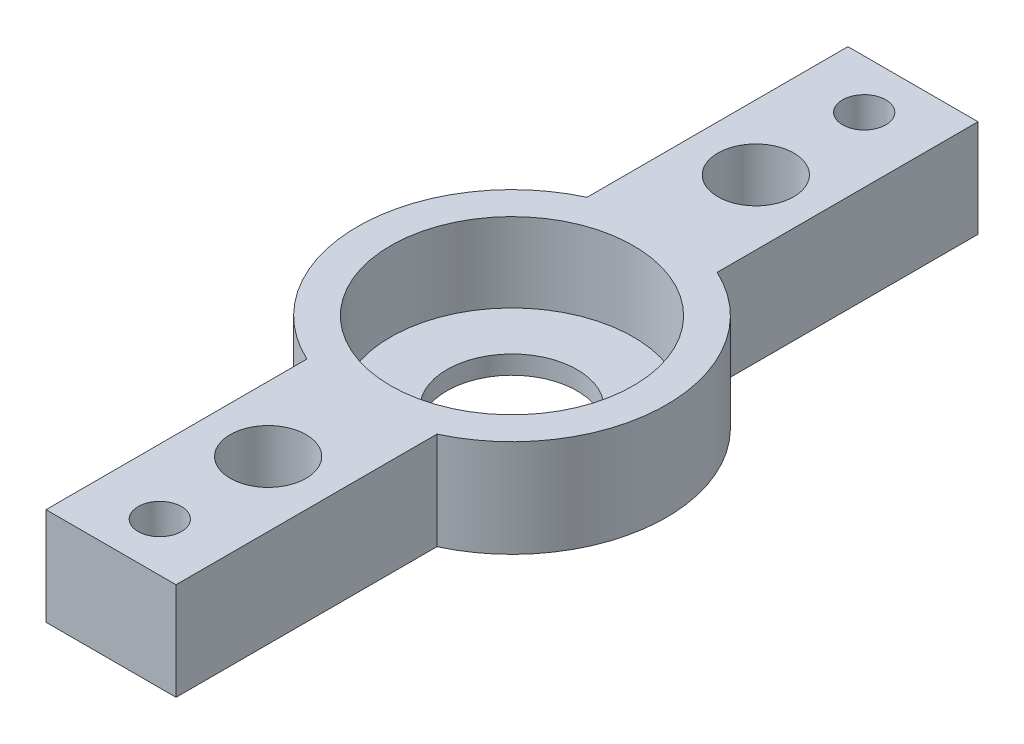
ISO-10303-21;
HEADER;
FILE_DESCRIPTION(('STEP AP214'),'2;1');
FILE_NAME('part.step','',(''),(''),'','','');
FILE_SCHEMA(('AUTOMOTIVE_DESIGN { 1 0 10303 214 1 1 1 1 }'));
ENDSEC;
DATA;
#1=APPLICATION_CONTEXT('core data for automotive mechanical design processes');
#2=APPLICATION_PROTOCOL_DEFINITION('international standard','automotive_design',2000,#1);
#3=PRODUCT_CONTEXT('',#1,'mechanical');
#4=PRODUCT('Part','Part','',(#3));
#5=PRODUCT_RELATED_PRODUCT_CATEGORY('part','',(#4));
#6=PRODUCT_DEFINITION_FORMATION('','',#4);
#7=PRODUCT_DEFINITION_CONTEXT('part definition',#1,'design');
#8=PRODUCT_DEFINITION('design','',#6,#7);
#9=PRODUCT_DEFINITION_SHAPE('','',#8);
#10=(LENGTH_UNIT() NAMED_UNIT(*) SI_UNIT(.MILLI.,.METRE.));
#11=(NAMED_UNIT(*) PLANE_ANGLE_UNIT() SI_UNIT($,.RADIAN.));
#12=(NAMED_UNIT(*) SI_UNIT($,.STERADIAN.) SOLID_ANGLE_UNIT());
#13=UNCERTAINTY_MEASURE_WITH_UNIT(LENGTH_MEASURE(1.E-05),#10,'distance_accuracy_value','');
#14=(GEOMETRIC_REPRESENTATION_CONTEXT(3) GLOBAL_UNCERTAINTY_ASSIGNED_CONTEXT((#13)) GLOBAL_UNIT_ASSIGNED_CONTEXT((#10,
#11,#12)) REPRESENTATION_CONTEXT('',''));
#15=CARTESIAN_POINT('',(0.,0.,0.));
#16=DIRECTION('',(0.,0.,1.));
#17=DIRECTION('',(1.,0.,0.));
#18=AXIS2_PLACEMENT_3D('',#15,#16,#17);
#19=CARTESIAN_POINT('',(0.,9.,0.));
#20=DIRECTION('',(0.,1.,0.));
#21=DIRECTION('',(0.,0.,1.));
#22=AXIS2_PLACEMENT_3D('',#19,#20,#21);
#23=PLANE('',#22);
#24=CARTESIAN_POINT('',(0.,9.,0.));
#25=DIRECTION('',(0.,1.,0.));
#26=DIRECTION('',(0.,0.,1.));
#27=AXIS2_PLACEMENT_3D('',#24,#25,#26);
#28=CIRCLE('',#27,11.2);
#29=CARTESIAN_POINT('',(0.,9.,11.2));
#30=VERTEX_POINT('',#29);
#31=EDGE_CURVE('E241',#30,#30,#28,.T.);
#32=ORIENTED_EDGE('',*,*,#31,.F.);
#33=EDGE_LOOP('',(#32));
#34=FACE_BOUND('',#33,.T.);
#35=CARTESIAN_POINT('',(0.,9.,22.5));
#36=DIRECTION('',(0.,1.,0.));
#37=DIRECTION('',(0.,0.,-1.));
#38=AXIS2_PLACEMENT_3D('',#35,#36,#37);
#39=CIRCLE('',#38,3.5);
#40=CARTESIAN_POINT('',(0.,9.,19.));
#41=VERTEX_POINT('',#40);
#42=EDGE_CURVE('E221',#41,#41,#39,.T.);
#43=ORIENTED_EDGE('',*,*,#42,.F.);
#44=EDGE_LOOP('',(#43));
#45=FACE_BOUND('',#44,.T.);
#46=CARTESIAN_POINT('',(0.,9.,-22.5));
#47=DIRECTION('',(0.,1.,0.));
#48=DIRECTION('',(0.,0.,1.));
#49=AXIS2_PLACEMENT_3D('',#46,#47,#48);
#50=CIRCLE('',#49,3.5);
#51=CARTESIAN_POINT('',(0.,9.,-19.));
#52=VERTEX_POINT('',#51);
#53=EDGE_CURVE('E146',#52,#52,#50,.T.);
#54=ORIENTED_EDGE('',*,*,#53,.F.);
#55=EDGE_LOOP('',(#54));
#56=FACE_BOUND('',#55,.T.);
#57=DIRECTION('',(0.,0.,1.));
#58=VECTOR('',#57,1.);
#59=CARTESIAN_POINT('',(-6.,9.,-37.));
#60=LINE('',#59,#58);
#61=CARTESIAN_POINT('',(-6.,9.,-37.));
#62=VERTEX_POINT('',#61);
#63=CARTESIAN_POINT('',(-6.,9.,-12.9252659547106));
#64=VERTEX_POINT('',#63);
#65=EDGE_CURVE('E164',#62,#64,#60,.T.);
#66=ORIENTED_EDGE('',*,*,#65,.T.);
#67=CARTESIAN_POINT('',(0.,9.,0.));
#68=DIRECTION('',(0.,1.,0.));
#69=DIRECTION('',(0.,0.,1.));
#70=AXIS2_PLACEMENT_3D('',#67,#68,#69);
#71=CIRCLE('',#70,14.25);
#72=CARTESIAN_POINT('',(-6.,9.,12.9252659547106));
#73=VERTEX_POINT('',#72);
#74=EDGE_CURVE('E100',#64,#73,#71,.T.);
#75=ORIENTED_EDGE('',*,*,#74,.T.);
#76=DIRECTION('',(0.,0.,1.));
#77=VECTOR('',#76,1.);
#78=CARTESIAN_POINT('',(-6.,9.,37.));
#79=LINE('',#78,#77);
#80=CARTESIAN_POINT('',(-6.,9.,37.));
#81=VERTEX_POINT('',#80);
#82=EDGE_CURVE('E185',#73,#81,#79,.T.);
#83=ORIENTED_EDGE('',*,*,#82,.T.);
#84=DIRECTION('',(1.,0.,0.));
#85=VECTOR('',#84,1.);
#86=CARTESIAN_POINT('',(-6.,9.,37.));
#87=LINE('',#86,#85);
#88=CARTESIAN_POINT('',(6.,9.,37.));
#89=VERTEX_POINT('',#88);
#90=EDGE_CURVE('E199',#81,#89,#87,.T.);
#91=ORIENTED_EDGE('',*,*,#90,.T.);
#92=DIRECTION('',(0.,0.,-1.));
#93=VECTOR('',#92,1.);
#94=CARTESIAN_POINT('',(6.,9.,37.));
#95=LINE('',#94,#93);
#96=CARTESIAN_POINT('',(6.,9.,12.9252659547106));
#97=VERTEX_POINT('',#96);
#98=EDGE_CURVE('E119',#89,#97,#95,.T.);
#99=ORIENTED_EDGE('',*,*,#98,.T.);
#100=CARTESIAN_POINT('',(0.,9.,0.));
#101=DIRECTION('',(0.,1.,0.));
#102=DIRECTION('',(0.,0.,1.));
#103=AXIS2_PLACEMENT_3D('',#100,#101,#102);
#104=CIRCLE('',#103,14.25);
#105=CARTESIAN_POINT('',(6.,9.,-12.9252659547106));
#106=VERTEX_POINT('',#105);
#107=EDGE_CURVE('E113',#97,#106,#104,.T.);
#108=ORIENTED_EDGE('',*,*,#107,.T.);
#109=DIRECTION('',(0.,0.,-1.));
#110=VECTOR('',#109,1.);
#111=CARTESIAN_POINT('',(6.,9.,-37.));
#112=LINE('',#111,#110);
#113=CARTESIAN_POINT('',(6.,9.,-37.));
#114=VERTEX_POINT('',#113);
#115=EDGE_CURVE('E117',#106,#114,#112,.T.);
#116=ORIENTED_EDGE('',*,*,#115,.T.);
#117=DIRECTION('',(-1.,0.,0.));
#118=VECTOR('',#117,1.);
#119=CARTESIAN_POINT('',(-6.,9.,-37.));
#120=LINE('',#119,#118);
#121=EDGE_CURVE('E57',#114,#62,#120,.T.);
#122=ORIENTED_EDGE('',*,*,#121,.T.);
#123=EDGE_LOOP('',(#66,#75,#83,#91,#99,#108,#116,#122));
#124=FACE_BOUND('',#123,.T.);
#125=CARTESIAN_POINT('',(0.,9.,-32.5));
#126=DIRECTION('',(0.,1.,0.));
#127=DIRECTION('',(0.,0.,1.));
#128=AXIS2_PLACEMENT_3D('',#125,#126,#127);
#129=CIRCLE('',#128,2.);
#130=CARTESIAN_POINT('',(0.,9.,-30.5));
#131=VERTEX_POINT('',#130);
#132=EDGE_CURVE('E213',#131,#131,#129,.T.);
#133=ORIENTED_EDGE('',*,*,#132,.F.);
#134=EDGE_LOOP('',(#133));
#135=FACE_BOUND('',#134,.T.);
#136=CARTESIAN_POINT('',(0.,9.,32.5));
#137=DIRECTION('',(0.,1.,0.));
#138=DIRECTION('',(0.,0.,-1.));
#139=AXIS2_PLACEMENT_3D('',#136,#137,#138);
#140=CIRCLE('',#139,2.);
#141=CARTESIAN_POINT('',(0.,9.,30.5));
#142=VERTEX_POINT('',#141);
#143=EDGE_CURVE('E229',#142,#142,#140,.T.);
#144=ORIENTED_EDGE('',*,*,#143,.F.);
#145=EDGE_LOOP('',(#144));
#146=FACE_BOUND('',#145,.T.);
#147=ADVANCED_FACE('F39',(#34,#45,#56,#124,#135,#146),#23,.T.);
#148=CARTESIAN_POINT('',(0.,0.,0.));
#149=DIRECTION('',(0.,1.,0.));
#150=DIRECTION('',(0.,0.,1.));
#151=AXIS2_PLACEMENT_3D('',#148,#149,#150);
#152=PLANE('',#151);
#153=CARTESIAN_POINT('',(0.,0.,0.));
#154=DIRECTION('',(0.,1.,0.));
#155=DIRECTION('',(0.,0.,1.));
#156=AXIS2_PLACEMENT_3D('',#153,#154,#155);
#157=CIRCLE('',#156,6.);
#158=CARTESIAN_POINT('',(0.,0.,6.));
#159=VERTEX_POINT('',#158);
#160=EDGE_CURVE('E245',#159,#159,#157,.F.);
#161=ORIENTED_EDGE('',*,*,#160,.F.);
#162=EDGE_LOOP('',(#161));
#163=FACE_BOUND('',#162,.T.);
#164=DIRECTION('',(0.,0.,1.));
#165=VECTOR('',#164,1.);
#166=CARTESIAN_POINT('',(-6.,0.,-37.));
#167=LINE('',#166,#165);
#168=CARTESIAN_POINT('',(-6.,0.,-37.));
#169=VERTEX_POINT('',#168);
#170=CARTESIAN_POINT('',(-6.,0.,-12.9252659547106));
#171=VERTEX_POINT('',#170);
#172=EDGE_CURVE('E141',#169,#171,#167,.T.);
#173=ORIENTED_EDGE('',*,*,#172,.F.);
#174=DIRECTION('',(-1.,0.,0.));
#175=VECTOR('',#174,1.);
#176=CARTESIAN_POINT('',(-6.,0.,-37.));
#177=LINE('',#176,#175);
#178=CARTESIAN_POINT('',(6.,0.,-37.));
#179=VERTEX_POINT('',#178);
#180=EDGE_CURVE('E92',#179,#169,#177,.T.);
#181=ORIENTED_EDGE('',*,*,#180,.F.);
#182=DIRECTION('',(0.,0.,-1.));
#183=VECTOR('',#182,1.);
#184=CARTESIAN_POINT('',(6.,0.,-37.));
#185=LINE('',#184,#183);
#186=CARTESIAN_POINT('',(6.,0.,-12.9252659547106));
#187=VERTEX_POINT('',#186);
#188=EDGE_CURVE('E86',#187,#179,#185,.T.);
#189=ORIENTED_EDGE('',*,*,#188,.F.);
#190=CARTESIAN_POINT('',(0.,0.,0.));
#191=DIRECTION('',(0.,1.,0.));
#192=DIRECTION('',(0.,0.,1.));
#193=AXIS2_PLACEMENT_3D('',#190,#191,#192);
#194=CIRCLE('',#193,14.25);
#195=CARTESIAN_POINT('',(6.,0.,12.9252659547106));
#196=VERTEX_POINT('',#195);
#197=EDGE_CURVE('E128',#196,#187,#194,.T.);
#198=ORIENTED_EDGE('',*,*,#197,.F.);
#199=DIRECTION('',(0.,0.,-1.));
#200=VECTOR('',#199,1.);
#201=CARTESIAN_POINT('',(6.,0.,37.));
#202=LINE('',#201,#200);
#203=CARTESIAN_POINT('',(6.,0.,37.));
#204=VERTEX_POINT('',#203);
#205=EDGE_CURVE('E155',#204,#196,#202,.T.);
#206=ORIENTED_EDGE('',*,*,#205,.F.);
#207=DIRECTION('',(1.,0.,0.));
#208=VECTOR('',#207,1.);
#209=CARTESIAN_POINT('',(-6.,0.,37.));
#210=LINE('',#209,#208);
#211=CARTESIAN_POINT('',(-6.,0.,37.));
#212=VERTEX_POINT('',#211);
#213=EDGE_CURVE('E152',#212,#204,#210,.T.);
#214=ORIENTED_EDGE('',*,*,#213,.F.);
#215=DIRECTION('',(0.,0.,1.));
#216=VECTOR('',#215,1.);
#217=CARTESIAN_POINT('',(-6.,0.,37.));
#218=LINE('',#217,#216);
#219=CARTESIAN_POINT('',(-6.,0.,12.9252659547106));
#220=VERTEX_POINT('',#219);
#221=EDGE_CURVE('E149',#220,#212,#218,.T.);
#222=ORIENTED_EDGE('',*,*,#221,.F.);
#223=CARTESIAN_POINT('',(0.,0.,0.));
#224=DIRECTION('',(0.,1.,0.));
#225=DIRECTION('',(0.,0.,1.));
#226=AXIS2_PLACEMENT_3D('',#223,#224,#225);
#227=CIRCLE('',#226,14.25);
#228=EDGE_CURVE('E145',#171,#220,#227,.T.);
#229=ORIENTED_EDGE('',*,*,#228,.F.);
#230=EDGE_LOOP('',(#173,#181,#189,#198,#206,#214,#222,#229));
#231=FACE_BOUND('',#230,.T.);
#232=CARTESIAN_POINT('',(0.,0.,-22.5));
#233=DIRECTION('',(0.,1.,0.));
#234=DIRECTION('',(0.,0.,1.));
#235=AXIS2_PLACEMENT_3D('',#232,#233,#234);
#236=CIRCLE('',#235,3.5);
#237=CARTESIAN_POINT('',(0.,0.,-19.));
#238=VERTEX_POINT('',#237);
#239=EDGE_CURVE('E209',#238,#238,#236,.T.);
#240=ORIENTED_EDGE('',*,*,#239,.T.);
#241=EDGE_LOOP('',(#240));
#242=FACE_BOUND('',#241,.T.);
#243=CARTESIAN_POINT('',(0.,0.,-32.5));
#244=DIRECTION('',(0.,1.,0.));
#245=DIRECTION('',(0.,0.,1.));
#246=AXIS2_PLACEMENT_3D('',#243,#244,#245);
#247=CIRCLE('',#246,2.);
#248=CARTESIAN_POINT('',(0.,0.,-30.5));
#249=VERTEX_POINT('',#248);
#250=EDGE_CURVE('E217',#249,#249,#247,.T.);
#251=ORIENTED_EDGE('',*,*,#250,.T.);
#252=EDGE_LOOP('',(#251));
#253=FACE_BOUND('',#252,.T.);
#254=CARTESIAN_POINT('',(0.,0.,22.5));
#255=DIRECTION('',(0.,1.,0.));
#256=DIRECTION('',(0.,0.,-1.));
#257=AXIS2_PLACEMENT_3D('',#254,#255,#256);
#258=CIRCLE('',#257,3.5);
#259=CARTESIAN_POINT('',(0.,0.,19.));
#260=VERTEX_POINT('',#259);
#261=EDGE_CURVE('E225',#260,#260,#258,.T.);
#262=ORIENTED_EDGE('',*,*,#261,.T.);
#263=EDGE_LOOP('',(#262));
#264=FACE_BOUND('',#263,.T.);
#265=CARTESIAN_POINT('',(0.,0.,32.5));
#266=DIRECTION('',(0.,1.,0.));
#267=DIRECTION('',(0.,0.,-1.));
#268=AXIS2_PLACEMENT_3D('',#265,#266,#267);
#269=CIRCLE('',#268,2.);
#270=CARTESIAN_POINT('',(0.,0.,30.5));
#271=VERTEX_POINT('',#270);
#272=EDGE_CURVE('E233',#271,#271,#269,.T.);
#273=ORIENTED_EDGE('',*,*,#272,.T.);
#274=EDGE_LOOP('',(#273));
#275=FACE_BOUND('',#274,.T.);
#276=ADVANCED_FACE('F189',(#163,#231,#242,#253,#264,#275),#152,.F.);
#277=CARTESIAN_POINT('',(-6.,9.,-37.));
#278=DIRECTION('',(1.,0.,0.));
#279=DIRECTION('',(0.,0.,-1.));
#280=AXIS2_PLACEMENT_3D('',#277,#278,#279);
#281=PLANE('',#280);
#282=ORIENTED_EDGE('',*,*,#172,.T.);
#283=DIRECTION('',(0.,-1.,0.));
#284=VECTOR('',#283,1.);
#285=CARTESIAN_POINT('',(-6.,9.,-12.9252659547106));
#286=LINE('',#285,#284);
#287=EDGE_CURVE('E11',#64,#171,#286,.T.);
#288=ORIENTED_EDGE('',*,*,#287,.F.);
#289=ORIENTED_EDGE('',*,*,#65,.F.);
#290=DIRECTION('',(0.,-1.,0.));
#291=VECTOR('',#290,1.);
#292=CARTESIAN_POINT('',(-6.,9.,-37.));
#293=LINE('',#292,#291);
#294=EDGE_CURVE('E137',#62,#169,#293,.T.);
#295=ORIENTED_EDGE('',*,*,#294,.T.);
#296=EDGE_LOOP('',(#282,#288,#289,#295));
#297=FACE_BOUND('',#296,.T.);
#298=ADVANCED_FACE('F41',(#297),#281,.F.);
#299=CARTESIAN_POINT('',(0.,9.,0.));
#300=DIRECTION('',(0.,-1.,0.));
#301=DIRECTION('',(0.,0.,-1.));
#302=AXIS2_PLACEMENT_3D('',#299,#300,#301);
#303=CYLINDRICAL_SURFACE('',#302,14.25);
#304=ORIENTED_EDGE('',*,*,#228,.T.);
#305=DIRECTION('',(0.,-1.,0.));
#306=VECTOR('',#305,1.);
#307=CARTESIAN_POINT('',(-6.,9.,12.9252659547106));
#308=LINE('',#307,#306);
#309=EDGE_CURVE('E49',#73,#220,#308,.T.);
#310=ORIENTED_EDGE('',*,*,#309,.F.);
#311=ORIENTED_EDGE('',*,*,#74,.F.);
#312=ORIENTED_EDGE('',*,*,#287,.T.);
#313=EDGE_LOOP('',(#304,#310,#311,#312));
#314=FACE_BOUND('',#313,.T.);
#315=ADVANCED_FACE('F321',(#314),#303,.T.);
#316=CARTESIAN_POINT('',(-6.,9.,37.));
#317=DIRECTION('',(1.,0.,0.));
#318=DIRECTION('',(0.,0.,-1.));
#319=AXIS2_PLACEMENT_3D('',#316,#317,#318);
#320=PLANE('',#319);
#321=ORIENTED_EDGE('',*,*,#221,.T.);
#322=DIRECTION('',(0.,-1.,0.));
#323=VECTOR('',#322,1.);
#324=CARTESIAN_POINT('',(-6.,9.,37.));
#325=LINE('',#324,#323);
#326=EDGE_CURVE('E175',#81,#212,#325,.T.);
#327=ORIENTED_EDGE('',*,*,#326,.F.);
#328=ORIENTED_EDGE('',*,*,#82,.F.);
#329=ORIENTED_EDGE('',*,*,#309,.T.);
#330=EDGE_LOOP('',(#321,#327,#328,#329));
#331=FACE_BOUND('',#330,.T.);
#332=ADVANCED_FACE('F183',(#331),#320,.F.);
#333=CARTESIAN_POINT('',(-6.,9.,37.));
#334=DIRECTION('',(0.,0.,-1.));
#335=DIRECTION('',(-1.,0.,0.));
#336=AXIS2_PLACEMENT_3D('',#333,#334,#335);
#337=PLANE('',#336);
#338=ORIENTED_EDGE('',*,*,#213,.T.);
#339=DIRECTION('',(0.,-1.,0.));
#340=VECTOR('',#339,1.);
#341=CARTESIAN_POINT('',(6.,9.,37.));
#342=LINE('',#341,#340);
#343=EDGE_CURVE('E171',#89,#204,#342,.T.);
#344=ORIENTED_EDGE('',*,*,#343,.F.);
#345=ORIENTED_EDGE('',*,*,#90,.F.);
#346=ORIENTED_EDGE('',*,*,#326,.T.);
#347=EDGE_LOOP('',(#338,#344,#345,#346));
#348=FACE_BOUND('',#347,.T.);
#349=ADVANCED_FACE('F194',(#348),#337,.F.);
#350=CARTESIAN_POINT('',(6.,9.,37.));
#351=DIRECTION('',(-1.,0.,0.));
#352=DIRECTION('',(0.,0.,1.));
#353=AXIS2_PLACEMENT_3D('',#350,#351,#352);
#354=PLANE('',#353);
#355=ORIENTED_EDGE('',*,*,#205,.T.);
#356=DIRECTION('',(0.,-1.,0.));
#357=VECTOR('',#356,1.);
#358=CARTESIAN_POINT('',(6.,9.,12.9252659547106));
#359=LINE('',#358,#357);
#360=EDGE_CURVE('E130',#97,#196,#359,.T.);
#361=ORIENTED_EDGE('',*,*,#360,.F.);
#362=ORIENTED_EDGE('',*,*,#98,.F.);
#363=ORIENTED_EDGE('',*,*,#343,.T.);
#364=EDGE_LOOP('',(#355,#361,#362,#363));
#365=FACE_BOUND('',#364,.T.);
#366=ADVANCED_FACE('F197',(#365),#354,.F.);
#367=CARTESIAN_POINT('',(0.,9.,0.));
#368=DIRECTION('',(0.,-1.,0.));
#369=DIRECTION('',(0.,0.,-1.));
#370=AXIS2_PLACEMENT_3D('',#367,#368,#369);
#371=CYLINDRICAL_SURFACE('',#370,14.25);
#372=ORIENTED_EDGE('',*,*,#197,.T.);
#373=DIRECTION('',(0.,-1.,0.));
#374=VECTOR('',#373,1.);
#375=CARTESIAN_POINT('',(6.,9.,-12.9252659547106));
#376=LINE('',#375,#374);
#377=EDGE_CURVE('E125',#106,#187,#376,.T.);
#378=ORIENTED_EDGE('',*,*,#377,.F.);
#379=ORIENTED_EDGE('',*,*,#107,.F.);
#380=ORIENTED_EDGE('',*,*,#360,.T.);
#381=EDGE_LOOP('',(#372,#378,#379,#380));
#382=FACE_BOUND('',#381,.T.);
#383=ADVANCED_FACE('F126',(#382),#371,.T.);
#384=CARTESIAN_POINT('',(6.,9.,-37.));
#385=DIRECTION('',(-1.,0.,0.));
#386=DIRECTION('',(0.,0.,1.));
#387=AXIS2_PLACEMENT_3D('',#384,#385,#386);
#388=PLANE('',#387);
#389=ORIENTED_EDGE('',*,*,#188,.T.);
#390=DIRECTION('',(0.,-1.,0.));
#391=VECTOR('',#390,1.);
#392=CARTESIAN_POINT('',(6.,9.,-37.));
#393=LINE('',#392,#391);
#394=EDGE_CURVE('E131',#114,#179,#393,.T.);
#395=ORIENTED_EDGE('',*,*,#394,.F.);
#396=ORIENTED_EDGE('',*,*,#115,.F.);
#397=ORIENTED_EDGE('',*,*,#377,.T.);
#398=EDGE_LOOP('',(#389,#395,#396,#397));
#399=FACE_BOUND('',#398,.T.);
#400=ADVANCED_FACE('F133',(#399),#388,.F.);
#401=CARTESIAN_POINT('',(-6.,9.,-37.));
#402=DIRECTION('',(0.,0.,1.));
#403=DIRECTION('',(1.,0.,0.));
#404=AXIS2_PLACEMENT_3D('',#401,#402,#403);
#405=PLANE('',#404);
#406=ORIENTED_EDGE('',*,*,#180,.T.);
#407=ORIENTED_EDGE('',*,*,#294,.F.);
#408=ORIENTED_EDGE('',*,*,#121,.F.);
#409=ORIENTED_EDGE('',*,*,#394,.T.);
#410=EDGE_LOOP('',(#406,#407,#408,#409));
#411=FACE_BOUND('',#410,.T.);
#412=ADVANCED_FACE('F284',(#411),#405,.F.);
#413=CARTESIAN_POINT('',(0.,9.,-22.5));
#414=DIRECTION('',(0.,-1.,0.));
#415=DIRECTION('',(0.,0.,-1.));
#416=AXIS2_PLACEMENT_3D('',#413,#414,#415);
#417=CYLINDRICAL_SURFACE('',#416,3.5);
#418=ORIENTED_EDGE('',*,*,#53,.T.);
#419=EDGE_LOOP('',(#418));
#420=FACE_BOUND('',#419,.T.);
#421=ORIENTED_EDGE('',*,*,#239,.F.);
#422=EDGE_LOOP('',(#421));
#423=FACE_BOUND('',#422,.T.);
#424=ADVANCED_FACE('F280',(#420,#423),#417,.F.);
#425=CARTESIAN_POINT('',(0.,9.,-32.5));
#426=DIRECTION('',(0.,-1.,0.));
#427=DIRECTION('',(0.,0.,-1.));
#428=AXIS2_PLACEMENT_3D('',#425,#426,#427);
#429=CYLINDRICAL_SURFACE('',#428,2.);
#430=ORIENTED_EDGE('',*,*,#132,.T.);
#431=EDGE_LOOP('',(#430));
#432=FACE_BOUND('',#431,.T.);
#433=ORIENTED_EDGE('',*,*,#250,.F.);
#434=EDGE_LOOP('',(#433));
#435=FACE_BOUND('',#434,.T.);
#436=ADVANCED_FACE('F283',(#432,#435),#429,.F.);
#437=CARTESIAN_POINT('',(0.,9.,22.5));
#438=DIRECTION('',(0.,-1.,0.));
#439=DIRECTION('',(0.,0.,-1.));
#440=AXIS2_PLACEMENT_3D('',#437,#438,#439);
#441=CYLINDRICAL_SURFACE('',#440,3.5);
#442=ORIENTED_EDGE('',*,*,#42,.T.);
#443=EDGE_LOOP('',(#442));
#444=FACE_BOUND('',#443,.T.);
#445=ORIENTED_EDGE('',*,*,#261,.F.);
#446=EDGE_LOOP('',(#445));
#447=FACE_BOUND('',#446,.T.);
#448=ADVANCED_FACE('F298',(#444,#447),#441,.F.);
#449=CARTESIAN_POINT('',(0.,9.,32.5));
#450=DIRECTION('',(0.,-1.,0.));
#451=DIRECTION('',(0.,0.,-1.));
#452=AXIS2_PLACEMENT_3D('',#449,#450,#451);
#453=CYLINDRICAL_SURFACE('',#452,2.);
#454=ORIENTED_EDGE('',*,*,#143,.T.);
#455=EDGE_LOOP('',(#454));
#456=FACE_BOUND('',#455,.T.);
#457=ORIENTED_EDGE('',*,*,#272,.F.);
#458=EDGE_LOOP('',(#457));
#459=FACE_BOUND('',#458,.T.);
#460=ADVANCED_FACE('F269',(#456,#459),#453,.F.);
#461=CARTESIAN_POINT('',(0.,1.7,0.));
#462=DIRECTION('',(0.,1.,0.));
#463=DIRECTION('',(0.,0.,1.));
#464=AXIS2_PLACEMENT_3D('',#461,#462,#463);
#465=CYLINDRICAL_SURFACE('',#464,11.2);
#466=CARTESIAN_POINT('',(0.,1.7,0.));
#467=DIRECTION('',(0.,1.,0.));
#468=DIRECTION('',(0.,0.,1.));
#469=AXIS2_PLACEMENT_3D('',#466,#467,#468);
#470=CIRCLE('',#469,11.2);
#471=CARTESIAN_POINT('',(0.,1.7,11.2));
#472=VERTEX_POINT('',#471);
#473=EDGE_CURVE('E237',#472,#472,#470,.T.);
#474=ORIENTED_EDGE('',*,*,#473,.F.);
#475=EDGE_LOOP('',(#474));
#476=FACE_BOUND('',#475,.T.);
#477=ORIENTED_EDGE('',*,*,#31,.T.);
#478=EDGE_LOOP('',(#477));
#479=FACE_BOUND('',#478,.T.);
#480=ADVANCED_FACE('F263',(#476,#479),#465,.F.);
#481=CARTESIAN_POINT('',(0.,1.7,0.));
#482=DIRECTION('',(0.,1.,0.));
#483=DIRECTION('',(0.,0.,1.));
#484=AXIS2_PLACEMENT_3D('',#481,#482,#483);
#485=PLANE('',#484);
#486=CARTESIAN_POINT('',(0.,1.7,0.));
#487=DIRECTION('',(0.,1.,0.));
#488=DIRECTION('',(0.,0.,1.));
#489=AXIS2_PLACEMENT_3D('',#486,#487,#488);
#490=CIRCLE('',#489,6.);
#491=CARTESIAN_POINT('',(0.,1.7,6.));
#492=VERTEX_POINT('',#491);
#493=EDGE_CURVE('E252',#492,#492,#490,.T.);
#494=ORIENTED_EDGE('',*,*,#493,.F.);
#495=EDGE_LOOP('',(#494));
#496=FACE_BOUND('',#495,.T.);
#497=ORIENTED_EDGE('',*,*,#473,.T.);
#498=EDGE_LOOP('',(#497));
#499=FACE_BOUND('',#498,.T.);
#500=ADVANCED_FACE('F260',(#496,#499),#485,.T.);
#501=CARTESIAN_POINT('',(0.,-0.000999999999999916,0.));
#502=DIRECTION('',(0.,1.,0.));
#503=DIRECTION('',(0.,0.,1.));
#504=AXIS2_PLACEMENT_3D('',#501,#502,#503);
#505=CYLINDRICAL_SURFACE('',#504,6.);
#506=ORIENTED_EDGE('',*,*,#493,.T.);
#507=EDGE_LOOP('',(#506));
#508=FACE_BOUND('',#507,.T.);
#509=ORIENTED_EDGE('',*,*,#160,.T.);
#510=EDGE_LOOP('',(#509));
#511=FACE_BOUND('',#510,.T.);
#512=ADVANCED_FACE('F257',(#508,#511),#505,.F.);
#513=CLOSED_SHELL('',(#147,#276,#298,#315,#332,#349,#366,#383,#400,#412,#424,#436,#448,#460,
#480,#500,#512));
#514=MANIFOLD_SOLID_BREP('B2',#513);
#515=ADVANCED_BREP_SHAPE_REPRESENTATION('',(#18,#514),#14);
#516=SHAPE_DEFINITION_REPRESENTATION(#9,#515);
ENDSEC;
END-ISO-10303-21;
